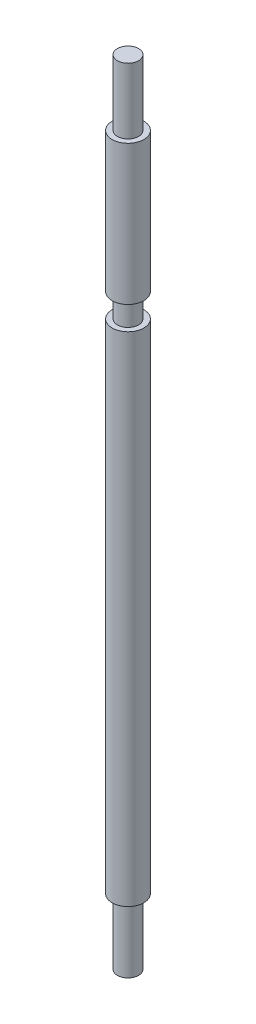
ISO-10303-21;
HEADER;
FILE_DESCRIPTION(('STEP AP214'),'2;1');
FILE_NAME('part.step','',(''),(''),'','','');
FILE_SCHEMA(('AUTOMOTIVE_DESIGN { 1 0 10303 214 1 1 1 1 }'));
ENDSEC;
DATA;
#1=APPLICATION_CONTEXT('core data for automotive mechanical design processes');
#2=APPLICATION_PROTOCOL_DEFINITION('international standard','automotive_design',2000,#1);
#3=PRODUCT_CONTEXT('',#1,'mechanical');
#4=PRODUCT('Part','Part','',(#3));
#5=PRODUCT_RELATED_PRODUCT_CATEGORY('part','',(#4));
#6=PRODUCT_DEFINITION_FORMATION('','',#4);
#7=PRODUCT_DEFINITION_CONTEXT('part definition',#1,'design');
#8=PRODUCT_DEFINITION('design','',#6,#7);
#9=PRODUCT_DEFINITION_SHAPE('','',#8);
#10=(LENGTH_UNIT() NAMED_UNIT(*) SI_UNIT(.MILLI.,.METRE.));
#11=(NAMED_UNIT(*) PLANE_ANGLE_UNIT() SI_UNIT($,.RADIAN.));
#12=(NAMED_UNIT(*) SI_UNIT($,.STERADIAN.) SOLID_ANGLE_UNIT());
#13=UNCERTAINTY_MEASURE_WITH_UNIT(LENGTH_MEASURE(1.E-05),#10,'distance_accuracy_value','');
#14=(GEOMETRIC_REPRESENTATION_CONTEXT(3) GLOBAL_UNCERTAINTY_ASSIGNED_CONTEXT((#13)) GLOBAL_UNIT_ASSIGNED_CONTEXT((#10,
#11,#12)) REPRESENTATION_CONTEXT('',''));
#15=CARTESIAN_POINT('',(0.,0.,0.));
#16=DIRECTION('',(0.,0.,1.));
#17=DIRECTION('',(1.,0.,0.));
#18=AXIS2_PLACEMENT_3D('',#15,#16,#17);
#19=CARTESIAN_POINT('',(0.,56.175,0.));
#20=DIRECTION('',(0.,-1.,0.));
#21=DIRECTION('',(0.,0.,-1.));
#22=AXIS2_PLACEMENT_3D('',#19,#20,#21);
#23=CYLINDRICAL_SURFACE('',#22,1.5);
#24=CARTESIAN_POINT('',(0.,27.075,0.));
#25=DIRECTION('',(0.,-1.,0.));
#26=DIRECTION('',(0.,0.,-1.));
#27=AXIS2_PLACEMENT_3D('',#24,#25,#26);
#28=CIRCLE('',#27,1.5);
#29=CARTESIAN_POINT('',(0.,27.075,-1.5));
#30=VERTEX_POINT('',#29);
#31=EDGE_CURVE('E38',#30,#30,#28,.T.);
#32=CARTESIAN_POINT('',(0.,23.725,0.));
#33=DIRECTION('',(0.,-1.,0.));
#34=DIRECTION('',(0.,0.,-1.));
#35=AXIS2_PLACEMENT_3D('',#32,#33,#34);
#36=CIRCLE('',#35,1.5);
#37=CARTESIAN_POINT('',(0.,23.725,-1.5));
#38=VERTEX_POINT('',#37);
#39=EDGE_CURVE('E11',#38,#38,#36,.T.);
#40=CARTESIAN_POINT('',(0.,27.075,-1.5));
#41=CARTESIAN_POINT('',(0.,27.0401041666667,-1.5));
#42=CARTESIAN_POINT('',(0.,27.0052083333333,-1.5));
#43=CARTESIAN_POINT('',(0.,26.9354166666667,-1.5));
#44=CARTESIAN_POINT('',(0.,26.9005208333333,-1.5));
#45=CARTESIAN_POINT('',(0.,26.8307291666667,-1.5));
#46=CARTESIAN_POINT('',(0.,26.7958333333333,-1.5));
#47=CARTESIAN_POINT('',(0.,26.7260416666667,-1.5));
#48=CARTESIAN_POINT('',(0.,26.6911458333333,-1.5));
#49=CARTESIAN_POINT('',(0.,26.6213541666667,-1.5));
#50=CARTESIAN_POINT('',(0.,26.5864583333333,-1.5));
#51=CARTESIAN_POINT('',(0.,26.5166666666667,-1.5));
#52=CARTESIAN_POINT('',(0.,26.4817708333333,-1.5));
#53=CARTESIAN_POINT('',(0.,26.4119791666667,-1.5));
#54=CARTESIAN_POINT('',(0.,26.3770833333333,-1.5));
#55=CARTESIAN_POINT('',(0.,26.3072916666667,-1.5));
#56=CARTESIAN_POINT('',(0.,26.2723958333333,-1.5));
#57=CARTESIAN_POINT('',(0.,26.2026041666667,-1.5));
#58=CARTESIAN_POINT('',(0.,26.1677083333333,-1.5));
#59=CARTESIAN_POINT('',(0.,26.0979166666667,-1.5));
#60=CARTESIAN_POINT('',(0.,26.0630208333333,-1.5));
#61=CARTESIAN_POINT('',(0.,25.9932291666667,-1.5));
#62=CARTESIAN_POINT('',(0.,25.9583333333333,-1.5));
#63=CARTESIAN_POINT('',(0.,25.8885416666667,-1.5));
#64=CARTESIAN_POINT('',(0.,25.8536458333333,-1.5));
#65=CARTESIAN_POINT('',(0.,25.7838541666667,-1.5));
#66=CARTESIAN_POINT('',(0.,25.7489583333333,-1.5));
#67=CARTESIAN_POINT('',(0.,25.6791666666667,-1.5));
#68=CARTESIAN_POINT('',(0.,25.6442708333333,-1.5));
#69=CARTESIAN_POINT('',(0.,25.5744791666667,-1.5));
#70=CARTESIAN_POINT('',(0.,25.5395833333333,-1.5));
#71=CARTESIAN_POINT('',(0.,25.4697916666667,-1.5));
#72=CARTESIAN_POINT('',(0.,25.4348958333333,-1.5));
#73=CARTESIAN_POINT('',(0.,25.3651041666667,-1.5));
#74=CARTESIAN_POINT('',(0.,25.3302083333333,-1.5));
#75=CARTESIAN_POINT('',(0.,25.2604166666667,-1.5));
#76=CARTESIAN_POINT('',(0.,25.2255208333333,-1.5));
#77=CARTESIAN_POINT('',(0.,25.1557291666666,-1.5));
#78=CARTESIAN_POINT('',(0.,25.1208333333333,-1.5));
#79=CARTESIAN_POINT('',(0.,25.0510416666667,-1.5));
#80=CARTESIAN_POINT('',(0.,25.0161458333333,-1.5));
#81=CARTESIAN_POINT('',(0.,24.9463541666667,-1.5));
#82=CARTESIAN_POINT('',(0.,24.9114583333333,-1.5));
#83=CARTESIAN_POINT('',(0.,24.8416666666667,-1.5));
#84=CARTESIAN_POINT('',(0.,24.8067708333333,-1.5));
#85=CARTESIAN_POINT('',(0.,24.7369791666667,-1.5));
#86=CARTESIAN_POINT('',(0.,24.7020833333333,-1.5));
#87=CARTESIAN_POINT('',(0.,24.6322916666667,-1.5));
#88=CARTESIAN_POINT('',(0.,24.5973958333333,-1.5));
#89=CARTESIAN_POINT('',(0.,24.5276041666667,-1.5));
#90=CARTESIAN_POINT('',(0.,24.4927083333333,-1.5));
#91=CARTESIAN_POINT('',(0.,24.4229166666667,-1.5));
#92=CARTESIAN_POINT('',(0.,24.3880208333333,-1.5));
#93=CARTESIAN_POINT('',(0.,24.3182291666667,-1.5));
#94=CARTESIAN_POINT('',(0.,24.2833333333333,-1.5));
#95=CARTESIAN_POINT('',(0.,24.2135416666667,-1.5));
#96=CARTESIAN_POINT('',(0.,24.1786458333333,-1.5));
#97=CARTESIAN_POINT('',(0.,24.1088541666667,-1.5));
#98=CARTESIAN_POINT('',(0.,24.0739583333333,-1.5));
#99=CARTESIAN_POINT('',(0.,24.0041666666667,-1.5));
#100=CARTESIAN_POINT('',(0.,23.9692708333333,-1.5));
#101=CARTESIAN_POINT('',(0.,23.8994791666667,-1.5));
#102=CARTESIAN_POINT('',(0.,23.8645833333333,-1.5));
#103=CARTESIAN_POINT('',(0.,23.7947916666667,-1.5));
#104=CARTESIAN_POINT('',(0.,23.7598958333333,-1.5));
#105=CARTESIAN_POINT('',(0.,23.725,-1.5));
#106=B_SPLINE_CURVE_WITH_KNOTS('',3,(#40,#41,#42,#43,#44,#45,#46,#47,#48,#49,#50,#51,#52,#53,
#54,#55,#56,#57,#58,#59,#60,#61,#62,#63,#64,#65,#66,#67,#68,#69,#70,#71,#72,#73,#74,#75,#76,#77,
#78,#79,#80,#81,#82,#83,#84,#85,#86,#87,#88,#89,#90,#91,#92,#93,#94,#95,#96,#97,#98,#99,#100,
#101,#102,#103,#104,#105),.UNSPECIFIED.,.F.,.F.,(4,2,2,2,2,2,2,2,2,2,2,2,2,2,2,2,2,2,2,2,2,2,2,
2,2,2,2,2,2,2,2,2,4),(0.,0.104687499999999,0.209375000000001,0.3140625,0.418749999999999,
0.523437500000001,0.628125,0.732812499999999,0.837499999999998,0.9421875,1.046875,1.1515625,
1.25625,1.3609375,1.465625,1.5703125,1.675,1.7796875,1.884375,1.9890625,2.09375,
2.19843749999999,2.30312499999999,2.4078125,2.5125,2.6171875,2.72187499999999,2.82656249999999,
2.93124999999999,3.03593749999999,3.140625,3.2453125,3.35),.UNSPECIFIED.);
#107=EDGE_CURVE('BSEAM34',#30,#38,#106,.T.);
#108=ORIENTED_EDGE('',*,*,#31,.T.);
#109=ORIENTED_EDGE('',*,*,#39,.F.);
#110=ORIENTED_EDGE('',*,*,#107,.T.);
#111=ORIENTED_EDGE('',*,*,#107,.F.);
#112=EDGE_LOOP('',(#108,#110,#109,#111));
#113=FACE_BOUND('',#112,.T.);
#114=ADVANCED_FACE('F34',(#113),#23,.T.);
#115=CARTESIAN_POINT('',(0.,-46.875,0.));
#116=DIRECTION('',(0.,-1.,0.));
#117=DIRECTION('',(0.,0.,-1.));
#118=AXIS2_PLACEMENT_3D('',#115,#116,#117);
#119=CIRCLE('',#118,1.5);
#120=CARTESIAN_POINT('',(0.,-46.875,-1.5));
#121=VERTEX_POINT('',#120);
#122=EDGE_CURVE('E51',#121,#121,#119,.T.);
#123=CARTESIAN_POINT('',(0.,-56.175,0.));
#124=DIRECTION('',(0.,1.,0.));
#125=DIRECTION('',(0.,0.,1.));
#126=AXIS2_PLACEMENT_3D('',#123,#124,#125);
#127=CIRCLE('',#126,1.5);
#128=CARTESIAN_POINT('',(0.,-56.175,-1.5));
#129=VERTEX_POINT('',#128);
#130=EDGE_CURVE('E47',#129,#129,#127,.T.);
#131=CARTESIAN_POINT('',(0.,-46.875,-1.5));
#132=CARTESIAN_POINT('',(0.,-46.971875,-1.5));
#133=CARTESIAN_POINT('',(0.,-47.06875,-1.5));
#134=CARTESIAN_POINT('',(0.,-47.2625,-1.5));
#135=CARTESIAN_POINT('',(0.,-47.359375,-1.5));
#136=CARTESIAN_POINT('',(0.,-47.553125,-1.5));
#137=CARTESIAN_POINT('',(0.,-47.65,-1.5));
#138=CARTESIAN_POINT('',(0.,-47.84375,-1.5));
#139=CARTESIAN_POINT('',(0.,-47.940625,-1.5));
#140=CARTESIAN_POINT('',(0.,-48.134375,-1.5));
#141=CARTESIAN_POINT('',(0.,-48.23125,-1.5));
#142=CARTESIAN_POINT('',(0.,-48.425,-1.5));
#143=CARTESIAN_POINT('',(0.,-48.521875,-1.5));
#144=CARTESIAN_POINT('',(0.,-48.715625,-1.5));
#145=CARTESIAN_POINT('',(0.,-48.8125,-1.5));
#146=CARTESIAN_POINT('',(0.,-49.00625,-1.5));
#147=CARTESIAN_POINT('',(0.,-49.103125,-1.5));
#148=CARTESIAN_POINT('',(0.,-49.296875,-1.5));
#149=CARTESIAN_POINT('',(0.,-49.39375,-1.5));
#150=CARTESIAN_POINT('',(0.,-49.5875,-1.5));
#151=CARTESIAN_POINT('',(0.,-49.684375,-1.5));
#152=CARTESIAN_POINT('',(0.,-49.878125,-1.5));
#153=CARTESIAN_POINT('',(0.,-49.975,-1.5));
#154=CARTESIAN_POINT('',(0.,-50.16875,-1.5));
#155=CARTESIAN_POINT('',(0.,-50.265625,-1.5));
#156=CARTESIAN_POINT('',(0.,-50.459375,-1.5));
#157=CARTESIAN_POINT('',(0.,-50.55625,-1.5));
#158=CARTESIAN_POINT('',(0.,-50.75,-1.5));
#159=CARTESIAN_POINT('',(0.,-50.846875,-1.5));
#160=CARTESIAN_POINT('',(0.,-51.040625,-1.5));
#161=CARTESIAN_POINT('',(0.,-51.1375,-1.5));
#162=CARTESIAN_POINT('',(0.,-51.33125,-1.5));
#163=CARTESIAN_POINT('',(0.,-51.428125,-1.5));
#164=CARTESIAN_POINT('',(0.,-51.621875,-1.5));
#165=CARTESIAN_POINT('',(0.,-51.71875,-1.5));
#166=CARTESIAN_POINT('',(0.,-51.9125,-1.5));
#167=CARTESIAN_POINT('',(0.,-52.009375,-1.5));
#168=CARTESIAN_POINT('',(0.,-52.203125,-1.5));
#169=CARTESIAN_POINT('',(0.,-52.3,-1.5));
#170=CARTESIAN_POINT('',(0.,-52.49375,-1.5));
#171=CARTESIAN_POINT('',(0.,-52.590625,-1.5));
#172=CARTESIAN_POINT('',(0.,-52.784375,-1.5));
#173=CARTESIAN_POINT('',(0.,-52.88125,-1.5));
#174=CARTESIAN_POINT('',(0.,-53.075,-1.5));
#175=CARTESIAN_POINT('',(0.,-53.171875,-1.5));
#176=CARTESIAN_POINT('',(0.,-53.365625,-1.5));
#177=CARTESIAN_POINT('',(0.,-53.4625,-1.5));
#178=CARTESIAN_POINT('',(0.,-53.65625,-1.5));
#179=CARTESIAN_POINT('',(0.,-53.753125,-1.5));
#180=CARTESIAN_POINT('',(0.,-53.946875,-1.5));
#181=CARTESIAN_POINT('',(0.,-54.04375,-1.5));
#182=CARTESIAN_POINT('',(0.,-54.2375,-1.5));
#183=CARTESIAN_POINT('',(0.,-54.334375,-1.5));
#184=CARTESIAN_POINT('',(0.,-54.528125,-1.5));
#185=CARTESIAN_POINT('',(0.,-54.625,-1.5));
#186=CARTESIAN_POINT('',(0.,-54.81875,-1.5));
#187=CARTESIAN_POINT('',(0.,-54.915625,-1.5));
#188=CARTESIAN_POINT('',(0.,-55.109375,-1.5));
#189=CARTESIAN_POINT('',(0.,-55.20625,-1.5));
#190=CARTESIAN_POINT('',(0.,-55.4,-1.5));
#191=CARTESIAN_POINT('',(0.,-55.496875,-1.5));
#192=CARTESIAN_POINT('',(0.,-55.690625,-1.5));
#193=CARTESIAN_POINT('',(0.,-55.7875,-1.5));
#194=CARTESIAN_POINT('',(0.,-55.98125,-1.5));
#195=CARTESIAN_POINT('',(0.,-56.078125,-1.5));
#196=CARTESIAN_POINT('',(0.,-56.175,-1.5));
#197=B_SPLINE_CURVE_WITH_KNOTS('',3,(#131,#132,#133,#134,#135,#136,#137,#138,#139,#140,#141,
#142,#143,#144,#145,#146,#147,#148,#149,#150,#151,#152,#153,#154,#155,#156,#157,#158,#159,#160,
#161,#162,#163,#164,#165,#166,#167,#168,#169,#170,#171,#172,#173,#174,#175,#176,#177,#178,#179,
#180,#181,#182,#183,#184,#185,#186,#187,#188,#189,#190,#191,#192,#193,#194,#195,#196),
.UNSPECIFIED.,.F.,.F.,(4,2,2,2,2,2,2,2,2,2,2,2,2,2,2,2,2,2,2,2,2,2,2,2,2,2,2,2,2,2,2,2,4),(0.,
0.290625000000003,0.581250000000005,0.871875000000008,1.16250000000001,1.453125,1.74375,
2.03437500000001,2.32500000000001,2.61562500000001,2.90625000000001,3.19687500000002,3.4875,
3.77812500000001,4.06875000000001,4.35937500000001,4.65000000000002,4.94062500000002,
5.23125000000002,5.52187500000002,5.81250000000003,6.10312500000001,6.39375000000002,
6.68437500000002,6.97500000000002,7.26562500000003,7.55625000000003,7.84687500000003,
8.13750000000002,8.42812500000002,8.71875000000002,9.00937500000003,9.30000000000003),.UNSPECIFIED.);
#198=EDGE_CURVE('BSEAM36',#121,#129,#197,.T.);
#199=ORIENTED_EDGE('',*,*,#122,.T.);
#200=ORIENTED_EDGE('',*,*,#130,.T.);
#201=ORIENTED_EDGE('',*,*,#198,.T.);
#202=ORIENTED_EDGE('',*,*,#198,.F.);
#203=EDGE_LOOP('',(#199,#201,#200,#202));
#204=FACE_BOUND('',#203,.T.);
#205=ADVANCED_FACE('F36',(#204),#23,.T.);
#206=CARTESIAN_POINT('',(0.,-56.175,0.));
#207=DIRECTION('',(0.,1.,0.));
#208=DIRECTION('',(0.,0.,1.));
#209=AXIS2_PLACEMENT_3D('',#206,#207,#208);
#210=PLANE('',#209);
#211=ORIENTED_EDGE('',*,*,#130,.F.);
#212=EDGE_LOOP('',(#211));
#213=FACE_BOUND('',#212,.T.);
#214=ADVANCED_FACE('F80',(#213),#210,.F.);
#215=CARTESIAN_POINT('',(0.,30.0889610306789,0.));
#216=DIRECTION('',(0.,-1.,0.));
#217=DIRECTION('',(0.,0.,-1.));
#218=AXIS2_PLACEMENT_3D('',#215,#216,#217);
#219=CYLINDRICAL_SURFACE('',#218,2.25);
#220=CARTESIAN_POINT('',(0.,23.725,0.));
#221=DIRECTION('',(0.,-1.,0.));
#222=DIRECTION('',(0.,0.,-1.));
#223=AXIS2_PLACEMENT_3D('',#220,#221,#222);
#224=CIRCLE('',#223,2.25);
#225=CARTESIAN_POINT('',(0.,23.725,-2.25));
#226=VERTEX_POINT('',#225);
#227=EDGE_CURVE('E53',#226,#226,#224,.F.);
#228=ORIENTED_EDGE('',*,*,#227,.F.);
#229=EDGE_LOOP('',(#228));
#230=FACE_BOUND('',#229,.T.);
#231=CARTESIAN_POINT('',(0.,-46.875,0.));
#232=DIRECTION('',(0.,-1.,0.));
#233=DIRECTION('',(0.,0.,-1.));
#234=AXIS2_PLACEMENT_3D('',#231,#232,#233);
#235=CIRCLE('',#234,2.25);
#236=CARTESIAN_POINT('',(0.,-46.875,-2.25));
#237=VERTEX_POINT('',#236);
#238=EDGE_CURVE('E60',#237,#237,#235,.T.);
#239=ORIENTED_EDGE('',*,*,#238,.F.);
#240=EDGE_LOOP('',(#239));
#241=FACE_BOUND('',#240,.T.);
#242=ADVANCED_FACE('F76',(#230,#241),#219,.T.);
#243=CARTESIAN_POINT('',(0.,-46.875,0.));
#244=DIRECTION('',(0.,-1.,0.));
#245=DIRECTION('',(0.,0.,-1.));
#246=AXIS2_PLACEMENT_3D('',#243,#244,#245);
#247=PLANE('',#246);
#248=ORIENTED_EDGE('',*,*,#122,.F.);
#249=EDGE_LOOP('',(#248));
#250=FACE_BOUND('',#249,.T.);
#251=ORIENTED_EDGE('',*,*,#238,.T.);
#252=EDGE_LOOP('',(#251));
#253=FACE_BOUND('',#252,.T.);
#254=ADVANCED_FACE('F79',(#250,#253),#247,.T.);
#255=CARTESIAN_POINT('',(0.,23.725,0.));
#256=DIRECTION('',(0.,-1.,0.));
#257=DIRECTION('',(0.780913492808822,0.,0.624639189251784));
#258=AXIS2_PLACEMENT_3D('',#255,#256,#257);
#259=PLANE('',#258);
#260=ORIENTED_EDGE('',*,*,#39,.T.);
#261=EDGE_LOOP('',(#260));
#262=FACE_BOUND('',#261,.T.);
#263=ORIENTED_EDGE('',*,*,#227,.T.);
#264=EDGE_LOOP('',(#263));
#265=FACE_BOUND('',#264,.T.);
#266=ADVANCED_FACE('F74',(#262,#265),#259,.F.);
#267=CARTESIAN_POINT('',(0.,27.075,0.));
#268=DIRECTION('',(0.,-1.,0.));
#269=DIRECTION('',(0.780913492808822,0.,0.624639189251784));
#270=AXIS2_PLACEMENT_3D('',#267,#268,#269);
#271=PLANE('',#270);
#272=ORIENTED_EDGE('',*,*,#31,.F.);
#273=EDGE_LOOP('',(#272));
#274=FACE_BOUND('',#273,.T.);
#275=CARTESIAN_POINT('',(0.,27.075,0.));
#276=DIRECTION('',(0.,-1.,0.));
#277=DIRECTION('',(0.,0.,-1.));
#278=AXIS2_PLACEMENT_3D('',#275,#276,#277);
#279=CIRCLE('',#278,2.25);
#280=CARTESIAN_POINT('',(0.,27.075,2.25));
#281=VERTEX_POINT('',#280);
#282=EDGE_CURVE('E56',#281,#281,#279,.F.);
#283=ORIENTED_EDGE('',*,*,#282,.F.);
#284=EDGE_LOOP('',(#283));
#285=FACE_BOUND('',#284,.T.);
#286=ADVANCED_FACE('F90',(#274,#285),#271,.T.);
#287=CARTESIAN_POINT('',(0.,46.875,0.));
#288=DIRECTION('',(0.,1.,0.));
#289=DIRECTION('',(0.,0.,1.));
#290=AXIS2_PLACEMENT_3D('',#287,#288,#289);
#291=PLANE('',#290);
#292=CARTESIAN_POINT('',(0.,46.875,0.));
#293=DIRECTION('',(0.,1.,0.));
#294=DIRECTION('',(0.,0.,1.));
#295=AXIS2_PLACEMENT_3D('',#292,#293,#294);
#296=CIRCLE('',#295,1.5);
#297=CARTESIAN_POINT('',(0.,46.875,-1.5));
#298=VERTEX_POINT('',#297);
#299=EDGE_CURVE('E54',#298,#298,#296,.T.);
#300=ORIENTED_EDGE('',*,*,#299,.F.);
#301=EDGE_LOOP('',(#300));
#302=FACE_BOUND('',#301,.T.);
#303=CARTESIAN_POINT('',(0.,46.875,0.));
#304=DIRECTION('',(0.,1.,0.));
#305=DIRECTION('',(0.,0.,1.));
#306=AXIS2_PLACEMENT_3D('',#303,#304,#305);
#307=CIRCLE('',#306,2.25);
#308=CARTESIAN_POINT('',(0.,46.875,2.25));
#309=VERTEX_POINT('',#308);
#310=EDGE_CURVE('E62',#309,#309,#307,.T.);
#311=ORIENTED_EDGE('',*,*,#310,.T.);
#312=EDGE_LOOP('',(#311));
#313=FACE_BOUND('',#312,.T.);
#314=ADVANCED_FACE('F114',(#302,#313),#291,.T.);
#315=CARTESIAN_POINT('',(0.,17.3610389693211,0.));
#316=DIRECTION('',(0.,1.,0.));
#317=DIRECTION('',(0.,0.,1.));
#318=AXIS2_PLACEMENT_3D('',#315,#316,#317);
#319=CYLINDRICAL_SURFACE('',#318,2.25);
#320=CARTESIAN_POINT('',(0.,46.875,2.25));
#321=CARTESIAN_POINT('',(0.,46.66875,2.25));
#322=CARTESIAN_POINT('',(0.,46.4625,2.25));
#323=CARTESIAN_POINT('',(0.,46.05,2.25));
#324=CARTESIAN_POINT('',(0.,45.84375,2.25));
#325=CARTESIAN_POINT('',(0.,45.43125,2.25));
#326=CARTESIAN_POINT('',(0.,45.225,2.25));
#327=CARTESIAN_POINT('',(0.,44.8125,2.25));
#328=CARTESIAN_POINT('',(0.,44.60625,2.25));
#329=CARTESIAN_POINT('',(0.,44.19375,2.25));
#330=CARTESIAN_POINT('',(0.,43.9875,2.25));
#331=CARTESIAN_POINT('',(0.,43.575,2.25));
#332=CARTESIAN_POINT('',(0.,43.36875,2.25));
#333=CARTESIAN_POINT('',(0.,42.95625,2.25));
#334=CARTESIAN_POINT('',(0.,42.75,2.25));
#335=CARTESIAN_POINT('',(0.,42.3375,2.25));
#336=CARTESIAN_POINT('',(0.,42.13125,2.25));
#337=CARTESIAN_POINT('',(0.,41.71875,2.25));
#338=CARTESIAN_POINT('',(0.,41.5125,2.25));
#339=CARTESIAN_POINT('',(0.,41.1,2.25));
#340=CARTESIAN_POINT('',(0.,40.89375,2.25));
#341=CARTESIAN_POINT('',(0.,40.48125,2.25));
#342=CARTESIAN_POINT('',(0.,40.275,2.25));
#343=CARTESIAN_POINT('',(0.,39.8625,2.25));
#344=CARTESIAN_POINT('',(0.,39.65625,2.25));
#345=CARTESIAN_POINT('',(0.,39.24375,2.25));
#346=CARTESIAN_POINT('',(0.,39.0375,2.25));
#347=CARTESIAN_POINT('',(0.,38.625,2.25));
#348=CARTESIAN_POINT('',(0.,38.41875,2.25));
#349=CARTESIAN_POINT('',(0.,38.00625,2.25));
#350=CARTESIAN_POINT('',(0.,37.8,2.25));
#351=CARTESIAN_POINT('',(0.,37.3875,2.25));
#352=CARTESIAN_POINT('',(0.,37.18125,2.25));
#353=CARTESIAN_POINT('',(0.,36.76875,2.25));
#354=CARTESIAN_POINT('',(0.,36.5625,2.25));
#355=CARTESIAN_POINT('',(0.,36.15,2.25));
#356=CARTESIAN_POINT('',(0.,35.94375,2.25));
#357=CARTESIAN_POINT('',(0.,35.53125,2.25));
#358=CARTESIAN_POINT('',(0.,35.325,2.25));
#359=CARTESIAN_POINT('',(0.,34.9125,2.25));
#360=CARTESIAN_POINT('',(0.,34.70625,2.25));
#361=CARTESIAN_POINT('',(0.,34.29375,2.25));
#362=CARTESIAN_POINT('',(0.,34.0875,2.25));
#363=CARTESIAN_POINT('',(0.,33.675,2.25));
#364=CARTESIAN_POINT('',(0.,33.46875,2.25));
#365=CARTESIAN_POINT('',(0.,33.05625,2.25));
#366=CARTESIAN_POINT('',(0.,32.85,2.25));
#367=CARTESIAN_POINT('',(0.,32.4375,2.25));
#368=CARTESIAN_POINT('',(0.,32.23125,2.25));
#369=CARTESIAN_POINT('',(0.,31.81875,2.25));
#370=CARTESIAN_POINT('',(0.,31.6125,2.25));
#371=CARTESIAN_POINT('',(0.,31.2,2.25));
#372=CARTESIAN_POINT('',(0.,30.99375,2.25));
#373=CARTESIAN_POINT('',(0.,30.58125,2.25));
#374=CARTESIAN_POINT('',(0.,30.375,2.25));
#375=CARTESIAN_POINT('',(0.,29.9625,2.25));
#376=CARTESIAN_POINT('',(0.,29.75625,2.25));
#377=CARTESIAN_POINT('',(0.,29.34375,2.25));
#378=CARTESIAN_POINT('',(0.,29.1375,2.25));
#379=CARTESIAN_POINT('',(0.,28.725,2.25));
#380=CARTESIAN_POINT('',(0.,28.51875,2.25));
#381=CARTESIAN_POINT('',(0.,28.10625,2.25));
#382=CARTESIAN_POINT('',(0.,27.9,2.25));
#383=CARTESIAN_POINT('',(0.,27.4875,2.25));
#384=CARTESIAN_POINT('',(0.,27.28125,2.25));
#385=CARTESIAN_POINT('',(0.,27.075,2.25));
#386=B_SPLINE_CURVE_WITH_KNOTS('',3,(#320,#321,#322,#323,#324,#325,#326,#327,#328,#329,#330,
#331,#332,#333,#334,#335,#336,#337,#338,#339,#340,#341,#342,#343,#344,#345,#346,#347,#348,#349,
#350,#351,#352,#353,#354,#355,#356,#357,#358,#359,#360,#361,#362,#363,#364,#365,#366,#367,#368,
#369,#370,#371,#372,#373,#374,#375,#376,#377,#378,#379,#380,#381,#382,#383,#384,#385),
.UNSPECIFIED.,.F.,.F.,(4,2,2,2,2,2,2,2,2,2,2,2,2,2,2,2,2,2,2,2,2,2,2,2,2,2,2,2,2,2,2,2,4),(0.,
0.618750000000001,1.2375,1.85625,2.475,3.09375000000001,3.71250000000001,4.33125000000001,
4.95000000000001,5.56875000000001,6.18750000000001,6.80625000000001,7.425,8.04375,8.6625,
9.28125000000001,9.90000000000001,10.51875,11.1375,11.75625,12.375,12.99375,13.6125,14.23125,
14.85,15.46875,16.0875,16.70625,17.325,17.94375,18.5625,19.18125,19.8),.UNSPECIFIED.);
#387=EDGE_CURVE('BSEAM106',#309,#281,#386,.T.);
#388=ORIENTED_EDGE('',*,*,#310,.F.);
#389=ORIENTED_EDGE('',*,*,#282,.T.);
#390=ORIENTED_EDGE('',*,*,#387,.T.);
#391=ORIENTED_EDGE('',*,*,#387,.F.);
#392=EDGE_LOOP('',(#388,#390,#389,#391));
#393=FACE_BOUND('',#392,.T.);
#394=ADVANCED_FACE('F106',(#393),#319,.T.);
#395=CARTESIAN_POINT('',(0.,56.175,0.));
#396=DIRECTION('',(0.,1.,0.));
#397=DIRECTION('',(0.,0.,1.));
#398=AXIS2_PLACEMENT_3D('',#395,#396,#397);
#399=PLANE('',#398);
#400=CARTESIAN_POINT('',(0.,56.175,0.));
#401=DIRECTION('',(0.,1.,0.));
#402=DIRECTION('',(0.,0.,1.));
#403=AXIS2_PLACEMENT_3D('',#400,#401,#402);
#404=CIRCLE('',#403,1.5);
#405=CARTESIAN_POINT('',(0.,56.175,-1.5));
#406=VERTEX_POINT('',#405);
#407=EDGE_CURVE('E42',#406,#406,#404,.T.);
#408=ORIENTED_EDGE('',*,*,#407,.T.);
#409=EDGE_LOOP('',(#408));
#410=FACE_BOUND('',#409,.T.);
#411=ADVANCED_FACE('F102',(#410),#399,.T.);
#412=CARTESIAN_POINT('',(0.,46.875,-1.5));
#413=CARTESIAN_POINT('',(0.,46.971875,-1.5));
#414=CARTESIAN_POINT('',(0.,47.06875,-1.5));
#415=CARTESIAN_POINT('',(0.,47.2625,-1.5));
#416=CARTESIAN_POINT('',(0.,47.359375,-1.5));
#417=CARTESIAN_POINT('',(0.,47.553125,-1.5));
#418=CARTESIAN_POINT('',(0.,47.65,-1.5));
#419=CARTESIAN_POINT('',(0.,47.84375,-1.5));
#420=CARTESIAN_POINT('',(0.,47.940625,-1.5));
#421=CARTESIAN_POINT('',(0.,48.134375,-1.5));
#422=CARTESIAN_POINT('',(0.,48.23125,-1.5));
#423=CARTESIAN_POINT('',(0.,48.425,-1.5));
#424=CARTESIAN_POINT('',(0.,48.521875,-1.5));
#425=CARTESIAN_POINT('',(0.,48.715625,-1.5));
#426=CARTESIAN_POINT('',(0.,48.8125,-1.5));
#427=CARTESIAN_POINT('',(0.,49.00625,-1.5));
#428=CARTESIAN_POINT('',(0.,49.103125,-1.5));
#429=CARTESIAN_POINT('',(0.,49.296875,-1.5));
#430=CARTESIAN_POINT('',(0.,49.39375,-1.5));
#431=CARTESIAN_POINT('',(0.,49.5875,-1.5));
#432=CARTESIAN_POINT('',(0.,49.684375,-1.5));
#433=CARTESIAN_POINT('',(0.,49.878125,-1.5));
#434=CARTESIAN_POINT('',(0.,49.975,-1.5));
#435=CARTESIAN_POINT('',(0.,50.16875,-1.5));
#436=CARTESIAN_POINT('',(0.,50.265625,-1.5));
#437=CARTESIAN_POINT('',(0.,50.459375,-1.5));
#438=CARTESIAN_POINT('',(0.,50.55625,-1.5));
#439=CARTESIAN_POINT('',(0.,50.75,-1.5));
#440=CARTESIAN_POINT('',(0.,50.846875,-1.5));
#441=CARTESIAN_POINT('',(0.,51.040625,-1.5));
#442=CARTESIAN_POINT('',(0.,51.1375,-1.5));
#443=CARTESIAN_POINT('',(0.,51.33125,-1.5));
#444=CARTESIAN_POINT('',(0.,51.428125,-1.5));
#445=CARTESIAN_POINT('',(0.,51.621875,-1.5));
#446=CARTESIAN_POINT('',(0.,51.71875,-1.5));
#447=CARTESIAN_POINT('',(0.,51.9125,-1.5));
#448=CARTESIAN_POINT('',(0.,52.009375,-1.5));
#449=CARTESIAN_POINT('',(0.,52.203125,-1.5));
#450=CARTESIAN_POINT('',(0.,52.3,-1.5));
#451=CARTESIAN_POINT('',(0.,52.49375,-1.5));
#452=CARTESIAN_POINT('',(0.,52.590625,-1.5));
#453=CARTESIAN_POINT('',(0.,52.784375,-1.5));
#454=CARTESIAN_POINT('',(0.,52.88125,-1.5));
#455=CARTESIAN_POINT('',(0.,53.075,-1.5));
#456=CARTESIAN_POINT('',(0.,53.171875,-1.5));
#457=CARTESIAN_POINT('',(0.,53.365625,-1.5));
#458=CARTESIAN_POINT('',(0.,53.4625,-1.5));
#459=CARTESIAN_POINT('',(0.,53.65625,-1.5));
#460=CARTESIAN_POINT('',(0.,53.753125,-1.5));
#461=CARTESIAN_POINT('',(0.,53.946875,-1.5));
#462=CARTESIAN_POINT('',(0.,54.04375,-1.5));
#463=CARTESIAN_POINT('',(0.,54.2375,-1.5));
#464=CARTESIAN_POINT('',(0.,54.334375,-1.5));
#465=CARTESIAN_POINT('',(0.,54.528125,-1.5));
#466=CARTESIAN_POINT('',(0.,54.625,-1.5));
#467=CARTESIAN_POINT('',(0.,54.81875,-1.5));
#468=CARTESIAN_POINT('',(0.,54.915625,-1.5));
#469=CARTESIAN_POINT('',(0.,55.109375,-1.5));
#470=CARTESIAN_POINT('',(0.,55.20625,-1.5));
#471=CARTESIAN_POINT('',(0.,55.4,-1.5));
#472=CARTESIAN_POINT('',(0.,55.496875,-1.5));
#473=CARTESIAN_POINT('',(0.,55.690625,-1.5));
#474=CARTESIAN_POINT('',(0.,55.7875,-1.5));
#475=CARTESIAN_POINT('',(0.,55.98125,-1.5));
#476=CARTESIAN_POINT('',(0.,56.078125,-1.5));
#477=CARTESIAN_POINT('',(0.,56.175,-1.5));
#478=B_SPLINE_CURVE_WITH_KNOTS('',3,(#412,#413,#414,#415,#416,#417,#418,#419,#420,#421,#422,
#423,#424,#425,#426,#427,#428,#429,#430,#431,#432,#433,#434,#435,#436,#437,#438,#439,#440,#441,
#442,#443,#444,#445,#446,#447,#448,#449,#450,#451,#452,#453,#454,#455,#456,#457,#458,#459,#460,
#461,#462,#463,#464,#465,#466,#467,#468,#469,#470,#471,#472,#473,#474,#475,#476,#477),
.UNSPECIFIED.,.F.,.F.,(4,2,2,2,2,2,2,2,2,2,2,2,2,2,2,2,2,2,2,2,2,2,2,2,2,2,2,2,2,2,2,2,4),(0.,
0.290625000000003,0.581249999999998,0.871875000000001,1.1625,1.45312500000001,1.74375,
2.03437500000001,2.325,2.615625,2.90625000000001,3.196875,3.4875,3.778125,4.06875,
4.35937500000001,4.65,4.940625,5.23125000000001,5.521875,5.81250000000001,6.10312500000001,
6.39375,6.68437500000001,6.975,7.265625,7.55625000000001,7.846875,8.13750000000001,
8.42812500000001,8.71875,9.00937500000001,9.30000000000001),.UNSPECIFIED.);
#479=EDGE_CURVE('BSEAM95',#298,#406,#478,.T.);
#480=ORIENTED_EDGE('',*,*,#299,.T.);
#481=ORIENTED_EDGE('',*,*,#407,.F.);
#482=ORIENTED_EDGE('',*,*,#479,.T.);
#483=ORIENTED_EDGE('',*,*,#479,.F.);
#484=EDGE_LOOP('',(#480,#482,#481,#483));
#485=FACE_BOUND('',#484,.T.);
#486=ADVANCED_FACE('F95',(#485),#23,.T.);
#487=CLOSED_SHELL('',(#114,#205,#214,#242,#254,#266,#286,#314,#394,#411,#486));
#488=MANIFOLD_SOLID_BREP('B2',#487);
#489=ADVANCED_BREP_SHAPE_REPRESENTATION('',(#18,#488),#14);
#490=SHAPE_DEFINITION_REPRESENTATION(#9,#489);
ENDSEC;
END-ISO-10303-21;
